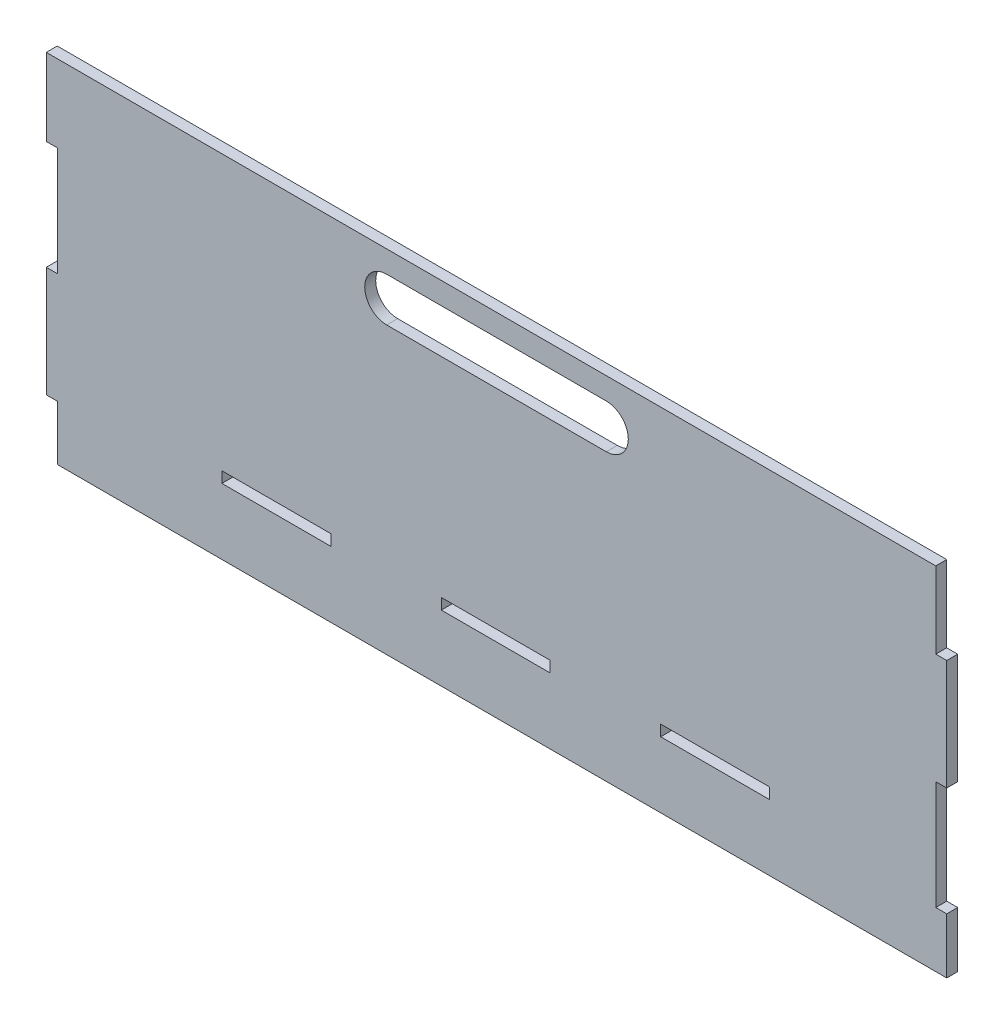
ISO-10303-21;
HEADER;
FILE_DESCRIPTION(('STEP AP214'),'2;1');
FILE_NAME('part.step','',(''),(''),'','','');
FILE_SCHEMA(('AUTOMOTIVE_DESIGN { 1 0 10303 214 1 1 1 1 }'));
ENDSEC;
DATA;
#1=APPLICATION_CONTEXT('core data for automotive mechanical design processes');
#2=APPLICATION_PROTOCOL_DEFINITION('international standard','automotive_design',2000,#1);
#3=PRODUCT_CONTEXT('',#1,'mechanical');
#4=PRODUCT('Part','Part','',(#3));
#5=PRODUCT_RELATED_PRODUCT_CATEGORY('part','',(#4));
#6=PRODUCT_DEFINITION_FORMATION('','',#4);
#7=PRODUCT_DEFINITION_CONTEXT('part definition',#1,'design');
#8=PRODUCT_DEFINITION('design','',#6,#7);
#9=PRODUCT_DEFINITION_SHAPE('','',#8);
#10=(LENGTH_UNIT() NAMED_UNIT(*) SI_UNIT(.MILLI.,.METRE.));
#11=(NAMED_UNIT(*) PLANE_ANGLE_UNIT() SI_UNIT($,.RADIAN.));
#12=(NAMED_UNIT(*) SI_UNIT($,.STERADIAN.) SOLID_ANGLE_UNIT());
#13=UNCERTAINTY_MEASURE_WITH_UNIT(LENGTH_MEASURE(1.E-05),#10,'distance_accuracy_value','');
#14=(GEOMETRIC_REPRESENTATION_CONTEXT(3) GLOBAL_UNCERTAINTY_ASSIGNED_CONTEXT((#13)) GLOBAL_UNIT_ASSIGNED_CONTEXT((#10,
#11,#12)) REPRESENTATION_CONTEXT('',''));
#15=CARTESIAN_POINT('',(0.,0.,0.));
#16=DIRECTION('',(0.,0.,1.));
#17=DIRECTION('',(1.,0.,0.));
#18=AXIS2_PLACEMENT_3D('',#15,#16,#17);
#19=CARTESIAN_POINT('',(410.,0.,5.));
#20=DIRECTION('',(-1.,0.,0.));
#21=DIRECTION('',(0.,0.,1.));
#22=AXIS2_PLACEMENT_3D('',#19,#20,#21);
#23=PLANE('',#22);
#24=DIRECTION('',(0.,1.,0.));
#25=VECTOR('',#24,1.);
#26=CARTESIAN_POINT('',(410.,0.,5.));
#27=LINE('',#26,#25);
#28=CARTESIAN_POINT('',(410.,74.9,5.));
#29=VERTEX_POINT('',#28);
#30=CARTESIAN_POINT('',(410.,125.2,5.));
#31=VERTEX_POINT('',#30);
#32=EDGE_CURVE('E440',#29,#31,#27,.T.);
#33=ORIENTED_EDGE('',*,*,#32,.F.);
#34=DIRECTION('',(0.,0.,-1.));
#35=VECTOR('',#34,1.);
#36=CARTESIAN_POINT('',(410.,74.9,5.));
#37=LINE('',#36,#35);
#38=CARTESIAN_POINT('',(410.,74.9,0.));
#39=VERTEX_POINT('',#38);
#40=EDGE_CURVE('E374',#29,#39,#37,.T.);
#41=ORIENTED_EDGE('',*,*,#40,.T.);
#42=DIRECTION('',(0.,1.,0.));
#43=VECTOR('',#42,1.);
#44=CARTESIAN_POINT('',(410.,0.,0.));
#45=LINE('',#44,#43);
#46=CARTESIAN_POINT('',(410.,125.2,0.));
#47=VERTEX_POINT('',#46);
#48=EDGE_CURVE('E449',#39,#47,#45,.T.);
#49=ORIENTED_EDGE('',*,*,#48,.T.);
#50=DIRECTION('',(0.,0.,1.));
#51=VECTOR('',#50,1.);
#52=CARTESIAN_POINT('',(410.,125.2,5.));
#53=LINE('',#52,#51);
#54=EDGE_CURVE('E390',#47,#31,#53,.T.);
#55=ORIENTED_EDGE('',*,*,#54,.T.);
#56=EDGE_LOOP('',(#33,#41,#49,#55));
#57=FACE_BOUND('',#56,.T.);
#58=ADVANCED_FACE('F34',(#57),#23,.F.);
#59=CARTESIAN_POINT('',(0.,0.,5.));
#60=DIRECTION('',(1.,0.,0.));
#61=DIRECTION('',(0.,0.,-1.));
#62=AXIS2_PLACEMENT_3D('',#59,#60,#61);
#63=PLANE('',#62);
#64=DIRECTION('',(0.,-1.,0.));
#65=VECTOR('',#64,1.);
#66=CARTESIAN_POINT('',(0.,0.,5.));
#67=LINE('',#66,#65);
#68=CARTESIAN_POINT('',(0.,160.,5.));
#69=VERTEX_POINT('',#68);
#70=CARTESIAN_POINT('',(0.,124.85,5.));
#71=VERTEX_POINT('',#70);
#72=EDGE_CURVE('E435',#69,#71,#67,.T.);
#73=ORIENTED_EDGE('',*,*,#72,.F.);
#74=DIRECTION('',(0.,0.,1.));
#75=VECTOR('',#74,1.);
#76=CARTESIAN_POINT('',(0.,160.,0.));
#77=LINE('',#76,#75);
#78=CARTESIAN_POINT('',(0.,160.,0.));
#79=VERTEX_POINT('',#78);
#80=EDGE_CURVE('E283',#79,#69,#77,.T.);
#81=ORIENTED_EDGE('',*,*,#80,.F.);
#82=DIRECTION('',(0.,-1.,0.));
#83=VECTOR('',#82,1.);
#84=CARTESIAN_POINT('',(0.,0.,0.));
#85=LINE('',#84,#83);
#86=CARTESIAN_POINT('',(0.,124.85,0.));
#87=VERTEX_POINT('',#86);
#88=EDGE_CURVE('E445',#79,#87,#85,.T.);
#89=ORIENTED_EDGE('',*,*,#88,.T.);
#90=DIRECTION('',(0.,0.,1.));
#91=VECTOR('',#90,1.);
#92=CARTESIAN_POINT('',(0.,124.85,5.));
#93=LINE('',#92,#91);
#94=EDGE_CURVE('E431',#87,#71,#93,.T.);
#95=ORIENTED_EDGE('',*,*,#94,.T.);
#96=EDGE_LOOP('',(#73,#81,#89,#95));
#97=FACE_BOUND('',#96,.T.);
#98=ADVANCED_FACE('F520',(#97),#63,.F.);
#99=CARTESIAN_POINT('',(0.,75.25,0.));
#100=VERTEX_POINT('',#99);
#101=CARTESIAN_POINT('',(0.,24.95,0.));
#102=VERTEX_POINT('',#101);
#103=EDGE_CURVE('E434',#100,#102,#85,.T.);
#104=ORIENTED_EDGE('',*,*,#103,.T.);
#105=DIRECTION('',(0.,0.,1.));
#106=VECTOR('',#105,1.);
#107=CARTESIAN_POINT('',(0.,24.95,5.));
#108=LINE('',#107,#106);
#109=CARTESIAN_POINT('',(0.,24.95,5.));
#110=VERTEX_POINT('',#109);
#111=EDGE_CURVE('E406',#102,#110,#108,.T.);
#112=ORIENTED_EDGE('',*,*,#111,.T.);
#113=CARTESIAN_POINT('',(0.,75.25,5.));
#114=VERTEX_POINT('',#113);
#115=EDGE_CURVE('E438',#114,#110,#67,.T.);
#116=ORIENTED_EDGE('',*,*,#115,.F.);
#117=DIRECTION('',(0.,0.,-1.));
#118=VECTOR('',#117,1.);
#119=CARTESIAN_POINT('',(0.,75.25,5.));
#120=LINE('',#119,#118);
#121=EDGE_CURVE('E426',#114,#100,#120,.T.);
#122=ORIENTED_EDGE('',*,*,#121,.T.);
#123=EDGE_LOOP('',(#104,#112,#116,#122));
#124=FACE_BOUND('',#123,.T.);
#125=ADVANCED_FACE('F525',(#124),#63,.F.);
#126=CARTESIAN_POINT('',(0.,0.,5.));
#127=DIRECTION('',(0.,1.,0.));
#128=DIRECTION('',(0.,0.,1.));
#129=AXIS2_PLACEMENT_3D('',#126,#127,#128);
#130=PLANE('',#129);
#131=DIRECTION('',(1.,0.,0.));
#132=VECTOR('',#131,1.);
#133=CARTESIAN_POINT('',(0.,0.,5.));
#134=LINE('',#133,#132);
#135=CARTESIAN_POINT('',(5.,0.,5.));
#136=VERTEX_POINT('',#135);
#137=CARTESIAN_POINT('',(410.,0.,5.));
#138=VERTEX_POINT('',#137);
#139=EDGE_CURVE('E437',#136,#138,#134,.T.);
#140=ORIENTED_EDGE('',*,*,#139,.F.);
#141=DIRECTION('',(0.,0.,-1.));
#142=VECTOR('',#141,1.);
#143=CARTESIAN_POINT('',(5.,0.,5.));
#144=LINE('',#143,#142);
#145=CARTESIAN_POINT('',(5.,0.,0.));
#146=VERTEX_POINT('',#145);
#147=EDGE_CURVE('E403',#136,#146,#144,.T.);
#148=ORIENTED_EDGE('',*,*,#147,.T.);
#149=DIRECTION('',(1.,0.,0.));
#150=VECTOR('',#149,1.);
#151=CARTESIAN_POINT('',(0.,0.,0.));
#152=LINE('',#151,#150);
#153=CARTESIAN_POINT('',(410.,0.,0.));
#154=VERTEX_POINT('',#153);
#155=EDGE_CURVE('E447',#146,#154,#152,.T.);
#156=ORIENTED_EDGE('',*,*,#155,.T.);
#157=DIRECTION('',(0.,0.,-1.));
#158=VECTOR('',#157,1.);
#159=CARTESIAN_POINT('',(410.,0.,5.));
#160=LINE('',#159,#158);
#161=EDGE_CURVE('E444',#138,#154,#160,.T.);
#162=ORIENTED_EDGE('',*,*,#161,.F.);
#163=EDGE_LOOP('',(#140,#148,#156,#162));
#164=FACE_BOUND('',#163,.T.);
#165=ADVANCED_FACE('F531',(#164),#130,.F.);
#166=CARTESIAN_POINT('',(410.,25.3,0.));
#167=VERTEX_POINT('',#166);
#168=EDGE_CURVE('E450',#154,#167,#45,.T.);
#169=ORIENTED_EDGE('',*,*,#168,.T.);
#170=DIRECTION('',(0.,0.,1.));
#171=VECTOR('',#170,1.);
#172=CARTESIAN_POINT('',(410.,25.3,5.));
#173=LINE('',#172,#171);
#174=CARTESIAN_POINT('',(410.,25.3,5.));
#175=VERTEX_POINT('',#174);
#176=EDGE_CURVE('E370',#167,#175,#173,.T.);
#177=ORIENTED_EDGE('',*,*,#176,.T.);
#178=EDGE_CURVE('E441',#138,#175,#27,.T.);
#179=ORIENTED_EDGE('',*,*,#178,.F.);
#180=ORIENTED_EDGE('',*,*,#161,.T.);
#181=EDGE_LOOP('',(#169,#177,#179,#180));
#182=FACE_BOUND('',#181,.T.);
#183=ADVANCED_FACE('F515',(#182),#23,.F.);
#184=CARTESIAN_POINT('',(0.,0.,5.));
#185=DIRECTION('',(0.,0.,-1.));
#186=DIRECTION('',(-1.,0.,0.));
#187=AXIS2_PLACEMENT_3D('',#184,#185,#186);
#188=PLANE('',#187);
#189=DIRECTION('',(1.,0.,0.));
#190=VECTOR('',#189,1.);
#191=CARTESIAN_POINT('',(155.,130.,5.));
#192=LINE('',#191,#190);
#193=CARTESIAN_POINT('',(155.,130.,5.));
#194=VERTEX_POINT('',#193);
#195=CARTESIAN_POINT('',(255.,130.,5.));
#196=VERTEX_POINT('',#195);
#197=EDGE_CURVE('E270',#194,#196,#192,.T.);
#198=ORIENTED_EDGE('',*,*,#197,.F.);
#199=CARTESIAN_POINT('',(155.,140.,5.));
#200=DIRECTION('',(0.,0.,1.));
#201=DIRECTION('',(1.,0.,0.));
#202=AXIS2_PLACEMENT_3D('',#199,#200,#201);
#203=CIRCLE('',#202,10.);
#204=CARTESIAN_POINT('',(155.,150.,5.));
#205=VERTEX_POINT('',#204);
#206=EDGE_CURVE('E49',#205,#194,#203,.T.);
#207=ORIENTED_EDGE('',*,*,#206,.F.);
#208=DIRECTION('',(-1.,0.,0.));
#209=VECTOR('',#208,1.);
#210=CARTESIAN_POINT('',(155.,150.,5.));
#211=LINE('',#210,#209);
#212=CARTESIAN_POINT('',(255.,150.,5.));
#213=VERTEX_POINT('',#212);
#214=EDGE_CURVE('E261',#213,#205,#211,.T.);
#215=ORIENTED_EDGE('',*,*,#214,.F.);
#216=CARTESIAN_POINT('',(255.,140.,5.));
#217=DIRECTION('',(0.,0.,1.));
#218=DIRECTION('',(1.,0.,0.));
#219=AXIS2_PLACEMENT_3D('',#216,#217,#218);
#220=CIRCLE('',#219,10.);
#221=EDGE_CURVE('E264',#196,#213,#220,.T.);
#222=ORIENTED_EDGE('',*,*,#221,.F.);
#223=EDGE_LOOP('',(#198,#207,#215,#222));
#224=FACE_BOUND('',#223,.T.);
#225=DIRECTION('',(1.,0.,0.));
#226=VECTOR('',#225,1.);
#227=CARTESIAN_POINT('',(179.85,30.,5.));
#228=LINE('',#227,#226);
#229=CARTESIAN_POINT('',(179.85,30.,5.));
#230=VERTEX_POINT('',#229);
#231=CARTESIAN_POINT('',(229.45,30.,5.));
#232=VERTEX_POINT('',#231);
#233=EDGE_CURVE('E288',#230,#232,#228,.T.);
#234=ORIENTED_EDGE('',*,*,#233,.F.);
#235=DIRECTION('',(0.,-1.,0.));
#236=VECTOR('',#235,1.);
#237=CARTESIAN_POINT('',(179.85,35.,5.));
#238=LINE('',#237,#236);
#239=CARTESIAN_POINT('',(179.85,35.,5.));
#240=VERTEX_POINT('',#239);
#241=EDGE_CURVE('E316',#240,#230,#238,.T.);
#242=ORIENTED_EDGE('',*,*,#241,.F.);
#243=DIRECTION('',(-1.,0.,0.));
#244=VECTOR('',#243,1.);
#245=CARTESIAN_POINT('',(179.85,35.,5.));
#246=LINE('',#245,#244);
#247=CARTESIAN_POINT('',(229.45,35.,5.));
#248=VERTEX_POINT('',#247);
#249=EDGE_CURVE('E308',#248,#240,#246,.T.);
#250=ORIENTED_EDGE('',*,*,#249,.F.);
#251=DIRECTION('',(0.,1.,0.));
#252=VECTOR('',#251,1.);
#253=CARTESIAN_POINT('',(229.45,35.,5.));
#254=LINE('',#253,#252);
#255=EDGE_CURVE('E300',#232,#248,#254,.T.);
#256=ORIENTED_EDGE('',*,*,#255,.F.);
#257=EDGE_LOOP('',(#234,#242,#250,#256));
#258=FACE_BOUND('',#257,.T.);
#259=DIRECTION('',(1.,0.,0.));
#260=VECTOR('',#259,1.);
#261=CARTESIAN_POINT('',(79.95,30.,5.));
#262=LINE('',#261,#260);
#263=CARTESIAN_POINT('',(79.95,30.,5.));
#264=VERTEX_POINT('',#263);
#265=CARTESIAN_POINT('',(129.55,30.,5.));
#266=VERTEX_POINT('',#265);
#267=EDGE_CURVE('E337',#264,#266,#262,.T.);
#268=ORIENTED_EDGE('',*,*,#267,.F.);
#269=DIRECTION('',(0.,-1.,0.));
#270=VECTOR('',#269,1.);
#271=CARTESIAN_POINT('',(79.95,35.,5.));
#272=LINE('',#271,#270);
#273=CARTESIAN_POINT('',(79.95,35.,5.));
#274=VERTEX_POINT('',#273);
#275=EDGE_CURVE('E321',#274,#264,#272,.T.);
#276=ORIENTED_EDGE('',*,*,#275,.F.);
#277=DIRECTION('',(-1.,0.,0.));
#278=VECTOR('',#277,1.);
#279=CARTESIAN_POINT('',(79.95,35.,5.));
#280=LINE('',#279,#278);
#281=CARTESIAN_POINT('',(129.55,35.,5.));
#282=VERTEX_POINT('',#281);
#283=EDGE_CURVE('E326',#282,#274,#280,.T.);
#284=ORIENTED_EDGE('',*,*,#283,.F.);
#285=DIRECTION('',(0.,1.,0.));
#286=VECTOR('',#285,1.);
#287=CARTESIAN_POINT('',(129.55,35.,5.));
#288=LINE('',#287,#286);
#289=EDGE_CURVE('E340',#266,#282,#288,.T.);
#290=ORIENTED_EDGE('',*,*,#289,.F.);
#291=EDGE_LOOP('',(#268,#276,#284,#290));
#292=FACE_BOUND('',#291,.T.);
#293=DIRECTION('',(0.,-1.,0.));
#294=VECTOR('',#293,1.);
#295=CARTESIAN_POINT('',(405.,174.8,5.));
#296=LINE('',#295,#294);
#297=CARTESIAN_POINT('',(405.,160.,5.));
#298=VERTEX_POINT('',#297);
#299=CARTESIAN_POINT('',(405.,125.2,5.));
#300=VERTEX_POINT('',#299);
#301=EDGE_CURVE('E377',#298,#300,#296,.T.);
#302=ORIENTED_EDGE('',*,*,#301,.F.);
#303=DIRECTION('',(1.,0.,0.));
#304=VECTOR('',#303,1.);
#305=CARTESIAN_POINT('',(0.,160.,5.));
#306=LINE('',#305,#304);
#307=EDGE_CURVE('E276',#69,#298,#306,.T.);
#308=ORIENTED_EDGE('',*,*,#307,.F.);
#309=ORIENTED_EDGE('',*,*,#72,.T.);
#310=DIRECTION('',(-1.,0.,0.));
#311=VECTOR('',#310,1.);
#312=CARTESIAN_POINT('',(-41.6760401275372,124.85,5.));
#313=LINE('',#312,#311);
#314=CARTESIAN_POINT('',(5.,124.85,5.));
#315=VERTEX_POINT('',#314);
#316=EDGE_CURVE('E414',#315,#71,#313,.T.);
#317=ORIENTED_EDGE('',*,*,#316,.F.);
#318=DIRECTION('',(0.,1.,0.));
#319=VECTOR('',#318,1.);
#320=CARTESIAN_POINT('',(5.,124.85,5.));
#321=LINE('',#320,#319);
#322=CARTESIAN_POINT('',(5.,75.25,5.));
#323=VERTEX_POINT('',#322);
#324=EDGE_CURVE('E419',#323,#315,#321,.T.);
#325=ORIENTED_EDGE('',*,*,#324,.F.);
#326=DIRECTION('',(1.,0.,0.));
#327=VECTOR('',#326,1.);
#328=CARTESIAN_POINT('',(-41.6760401275372,75.25,5.));
#329=LINE('',#328,#327);
#330=EDGE_CURVE('E409',#114,#323,#329,.T.);
#331=ORIENTED_EDGE('',*,*,#330,.F.);
#332=ORIENTED_EDGE('',*,*,#115,.T.);
#333=DIRECTION('',(-1.,0.,0.));
#334=VECTOR('',#333,1.);
#335=CARTESIAN_POINT('',(-41.6760401275372,24.95,5.));
#336=LINE('',#335,#334);
#337=CARTESIAN_POINT('',(5.,24.95,5.));
#338=VERTEX_POINT('',#337);
#339=EDGE_CURVE('E398',#338,#110,#336,.T.);
#340=ORIENTED_EDGE('',*,*,#339,.F.);
#341=DIRECTION('',(0.,1.,0.));
#342=VECTOR('',#341,1.);
#343=CARTESIAN_POINT('',(5.,24.95,5.));
#344=LINE('',#343,#342);
#345=EDGE_CURVE('E393',#136,#338,#344,.T.);
#346=ORIENTED_EDGE('',*,*,#345,.F.);
#347=ORIENTED_EDGE('',*,*,#139,.T.);
#348=ORIENTED_EDGE('',*,*,#178,.T.);
#349=DIRECTION('',(1.,0.,0.));
#350=VECTOR('',#349,1.);
#351=CARTESIAN_POINT('',(405.,25.3,5.));
#352=LINE('',#351,#350);
#353=CARTESIAN_POINT('',(405.,25.3,5.));
#354=VERTEX_POINT('',#353);
#355=EDGE_CURVE('E364',#354,#175,#352,.T.);
#356=ORIENTED_EDGE('',*,*,#355,.F.);
#357=DIRECTION('',(0.,-1.,0.));
#358=VECTOR('',#357,1.);
#359=CARTESIAN_POINT('',(405.,74.9,5.));
#360=LINE('',#359,#358);
#361=CARTESIAN_POINT('',(405.,74.9,5.));
#362=VERTEX_POINT('',#361);
#363=EDGE_CURVE('E347',#362,#354,#360,.T.);
#364=ORIENTED_EDGE('',*,*,#363,.F.);
#365=DIRECTION('',(-1.,0.,0.));
#366=VECTOR('',#365,1.);
#367=CARTESIAN_POINT('',(405.,74.9,5.));
#368=LINE('',#367,#366);
#369=EDGE_CURVE('E358',#29,#362,#368,.T.);
#370=ORIENTED_EDGE('',*,*,#369,.F.);
#371=ORIENTED_EDGE('',*,*,#32,.T.);
#372=DIRECTION('',(1.,0.,0.));
#373=VECTOR('',#372,1.);
#374=CARTESIAN_POINT('',(405.,125.2,5.));
#375=LINE('',#374,#373);
#376=EDGE_CURVE('E381',#300,#31,#375,.T.);
#377=ORIENTED_EDGE('',*,*,#376,.F.);
#378=EDGE_LOOP('',(#302,#308,#309,#317,#325,#331,#332,#340,#346,#347,#348,#356,#364,#370,#371,#377));
#379=FACE_BOUND('',#378,.T.);
#380=DIRECTION('',(0.,-1.,0.));
#381=VECTOR('',#380,1.);
#382=CARTESIAN_POINT('',(279.75,35.,5.));
#383=LINE('',#382,#381);
#384=CARTESIAN_POINT('',(279.75,35.,5.));
#385=VERTEX_POINT('',#384);
#386=CARTESIAN_POINT('',(279.75,30.,5.));
#387=VERTEX_POINT('',#386);
#388=EDGE_CURVE('E461',#385,#387,#383,.T.);
#389=ORIENTED_EDGE('',*,*,#388,.F.);
#390=DIRECTION('',(-1.,0.,0.));
#391=VECTOR('',#390,1.);
#392=CARTESIAN_POINT('',(279.75,35.,5.));
#393=LINE('',#392,#391);
#394=CARTESIAN_POINT('',(329.35,35.,5.));
#395=VERTEX_POINT('',#394);
#396=EDGE_CURVE('E463',#395,#385,#393,.T.);
#397=ORIENTED_EDGE('',*,*,#396,.F.);
#398=DIRECTION('',(0.,1.,0.));
#399=VECTOR('',#398,1.);
#400=CARTESIAN_POINT('',(329.35,35.,5.));
#401=LINE('',#400,#399);
#402=CARTESIAN_POINT('',(329.35,30.,5.));
#403=VERTEX_POINT('',#402);
#404=EDGE_CURVE('E466',#403,#395,#401,.T.);
#405=ORIENTED_EDGE('',*,*,#404,.F.);
#406=DIRECTION('',(1.,0.,0.));
#407=VECTOR('',#406,1.);
#408=CARTESIAN_POINT('',(279.75,30.,5.));
#409=LINE('',#408,#407);
#410=EDGE_CURVE('E469',#387,#403,#409,.T.);
#411=ORIENTED_EDGE('',*,*,#410,.F.);
#412=EDGE_LOOP('',(#389,#397,#405,#411));
#413=FACE_BOUND('',#412,.T.);
#414=ADVANCED_FACE('F498',(#224,#258,#292,#379,#413),#188,.F.);
#415=CARTESIAN_POINT('',(0.,0.,0.));
#416=DIRECTION('',(0.,0.,-1.));
#417=DIRECTION('',(-1.,0.,0.));
#418=AXIS2_PLACEMENT_3D('',#415,#416,#417);
#419=PLANE('',#418);
#420=CARTESIAN_POINT('',(155.,140.,0.));
#421=DIRECTION('',(0.,0.,1.));
#422=DIRECTION('',(1.,0.,0.));
#423=AXIS2_PLACEMENT_3D('',#420,#421,#422);
#424=CIRCLE('',#423,10.);
#425=CARTESIAN_POINT('',(155.,150.,0.));
#426=VERTEX_POINT('',#425);
#427=CARTESIAN_POINT('',(155.,130.,0.));
#428=VERTEX_POINT('',#427);
#429=EDGE_CURVE('E245',#426,#428,#424,.T.);
#430=ORIENTED_EDGE('',*,*,#429,.T.);
#431=DIRECTION('',(1.,0.,0.));
#432=VECTOR('',#431,1.);
#433=CARTESIAN_POINT('',(155.,130.,0.));
#434=LINE('',#433,#432);
#435=CARTESIAN_POINT('',(255.,130.,0.));
#436=VERTEX_POINT('',#435);
#437=EDGE_CURVE('E254',#428,#436,#434,.T.);
#438=ORIENTED_EDGE('',*,*,#437,.T.);
#439=CARTESIAN_POINT('',(255.,140.,0.));
#440=DIRECTION('',(0.,0.,1.));
#441=DIRECTION('',(1.,0.,0.));
#442=AXIS2_PLACEMENT_3D('',#439,#440,#441);
#443=CIRCLE('',#442,10.);
#444=CARTESIAN_POINT('',(255.,150.,0.));
#445=VERTEX_POINT('',#444);
#446=EDGE_CURVE('E57',#436,#445,#443,.T.);
#447=ORIENTED_EDGE('',*,*,#446,.T.);
#448=DIRECTION('',(-1.,0.,0.));
#449=VECTOR('',#448,1.);
#450=CARTESIAN_POINT('',(155.,150.,0.));
#451=LINE('',#450,#449);
#452=EDGE_CURVE('E251',#445,#426,#451,.T.);
#453=ORIENTED_EDGE('',*,*,#452,.T.);
#454=EDGE_LOOP('',(#430,#438,#447,#453));
#455=FACE_BOUND('',#454,.T.);
#456=DIRECTION('',(1.,0.,0.));
#457=VECTOR('',#456,1.);
#458=CARTESIAN_POINT('',(0.,160.,0.));
#459=LINE('',#458,#457);
#460=CARTESIAN_POINT('',(405.,160.,0.));
#461=VERTEX_POINT('',#460);
#462=EDGE_CURVE('E280',#79,#461,#459,.T.);
#463=ORIENTED_EDGE('',*,*,#462,.T.);
#464=DIRECTION('',(0.,-1.,0.));
#465=VECTOR('',#464,1.);
#466=CARTESIAN_POINT('',(405.,174.8,0.));
#467=LINE('',#466,#465);
#468=CARTESIAN_POINT('',(405.,125.2,0.));
#469=VERTEX_POINT('',#468);
#470=EDGE_CURVE('E378',#461,#469,#467,.T.);
#471=ORIENTED_EDGE('',*,*,#470,.T.);
#472=DIRECTION('',(1.,0.,0.));
#473=VECTOR('',#472,1.);
#474=CARTESIAN_POINT('',(405.,125.2,0.));
#475=LINE('',#474,#473);
#476=EDGE_CURVE('E380',#469,#47,#475,.T.);
#477=ORIENTED_EDGE('',*,*,#476,.T.);
#478=ORIENTED_EDGE('',*,*,#48,.F.);
#479=DIRECTION('',(1.,0.,0.));
#480=VECTOR('',#479,1.);
#481=CARTESIAN_POINT('',(0.,74.9,0.));
#482=LINE('',#481,#480);
#483=CARTESIAN_POINT('',(405.,74.9,0.));
#484=VERTEX_POINT('',#483);
#485=EDGE_CURVE('E459',#484,#39,#482,.T.);
#486=ORIENTED_EDGE('',*,*,#485,.F.);
#487=DIRECTION('',(0.,-1.,0.));
#488=VECTOR('',#487,1.);
#489=CARTESIAN_POINT('',(405.,74.9,0.));
#490=LINE('',#489,#488);
#491=CARTESIAN_POINT('',(405.,25.3,0.));
#492=VERTEX_POINT('',#491);
#493=EDGE_CURVE('E354',#484,#492,#490,.T.);
#494=ORIENTED_EDGE('',*,*,#493,.T.);
#495=DIRECTION('',(1.,0.,0.));
#496=VECTOR('',#495,1.);
#497=CARTESIAN_POINT('',(405.,25.3,0.));
#498=LINE('',#497,#496);
#499=EDGE_CURVE('E357',#492,#167,#498,.T.);
#500=ORIENTED_EDGE('',*,*,#499,.T.);
#501=ORIENTED_EDGE('',*,*,#168,.F.);
#502=ORIENTED_EDGE('',*,*,#155,.F.);
#503=DIRECTION('',(0.,-1.,0.));
#504=VECTOR('',#503,1.);
#505=CARTESIAN_POINT('',(5.,0.,0.));
#506=LINE('',#505,#504);
#507=CARTESIAN_POINT('',(5.,24.95,0.));
#508=VERTEX_POINT('',#507);
#509=EDGE_CURVE('E457',#508,#146,#506,.T.);
#510=ORIENTED_EDGE('',*,*,#509,.F.);
#511=DIRECTION('',(-1.,0.,0.));
#512=VECTOR('',#511,1.);
#513=CARTESIAN_POINT('',(-41.6760401275372,24.95,0.));
#514=LINE('',#513,#512);
#515=EDGE_CURVE('E394',#508,#102,#514,.T.);
#516=ORIENTED_EDGE('',*,*,#515,.T.);
#517=ORIENTED_EDGE('',*,*,#103,.F.);
#518=DIRECTION('',(-1.,0.,0.));
#519=VECTOR('',#518,1.);
#520=CARTESIAN_POINT('',(0.,75.25,0.));
#521=LINE('',#520,#519);
#522=CARTESIAN_POINT('',(5.,75.25,0.));
#523=VERTEX_POINT('',#522);
#524=EDGE_CURVE('E455',#523,#100,#521,.T.);
#525=ORIENTED_EDGE('',*,*,#524,.F.);
#526=DIRECTION('',(0.,1.,0.));
#527=VECTOR('',#526,1.);
#528=CARTESIAN_POINT('',(5.,124.85,0.));
#529=LINE('',#528,#527);
#530=CARTESIAN_POINT('',(5.,124.85,0.));
#531=VERTEX_POINT('',#530);
#532=EDGE_CURVE('E410',#523,#531,#529,.T.);
#533=ORIENTED_EDGE('',*,*,#532,.T.);
#534=DIRECTION('',(-1.,0.,0.));
#535=VECTOR('',#534,1.);
#536=CARTESIAN_POINT('',(-41.6760401275372,124.85,0.));
#537=LINE('',#536,#535);
#538=EDGE_CURVE('E413',#531,#87,#537,.T.);
#539=ORIENTED_EDGE('',*,*,#538,.T.);
#540=ORIENTED_EDGE('',*,*,#88,.F.);
#541=EDGE_LOOP('',(#463,#471,#477,#478,#486,#494,#500,#501,#502,#510,#516,#517,#525,#533,#539,#540));
#542=FACE_BOUND('',#541,.T.);
#543=DIRECTION('',(0.,-1.,0.));
#544=VECTOR('',#543,1.);
#545=CARTESIAN_POINT('',(179.85,35.,0.));
#546=LINE('',#545,#544);
#547=CARTESIAN_POINT('',(179.85,35.,0.));
#548=VERTEX_POINT('',#547);
#549=CARTESIAN_POINT('',(179.85,30.,0.));
#550=VERTEX_POINT('',#549);
#551=EDGE_CURVE('E318',#548,#550,#546,.T.);
#552=ORIENTED_EDGE('',*,*,#551,.T.);
#553=DIRECTION('',(1.,0.,0.));
#554=VECTOR('',#553,1.);
#555=CARTESIAN_POINT('',(179.85,30.,0.));
#556=LINE('',#555,#554);
#557=CARTESIAN_POINT('',(229.45,30.,0.));
#558=VERTEX_POINT('',#557);
#559=EDGE_CURVE('E291',#550,#558,#556,.T.);
#560=ORIENTED_EDGE('',*,*,#559,.T.);
#561=DIRECTION('',(0.,1.,0.));
#562=VECTOR('',#561,1.);
#563=CARTESIAN_POINT('',(229.45,35.,0.));
#564=LINE('',#563,#562);
#565=CARTESIAN_POINT('',(229.45,35.,0.));
#566=VERTEX_POINT('',#565);
#567=EDGE_CURVE('E305',#558,#566,#564,.T.);
#568=ORIENTED_EDGE('',*,*,#567,.T.);
#569=DIRECTION('',(-1.,0.,0.));
#570=VECTOR('',#569,1.);
#571=CARTESIAN_POINT('',(179.85,35.,0.));
#572=LINE('',#571,#570);
#573=EDGE_CURVE('E313',#566,#548,#572,.T.);
#574=ORIENTED_EDGE('',*,*,#573,.T.);
#575=EDGE_LOOP('',(#552,#560,#568,#574));
#576=FACE_BOUND('',#575,.T.);
#577=DIRECTION('',(0.,-1.,0.));
#578=VECTOR('',#577,1.);
#579=CARTESIAN_POINT('',(79.95,35.,0.));
#580=LINE('',#579,#578);
#581=CARTESIAN_POINT('',(79.95,35.,0.));
#582=VERTEX_POINT('',#581);
#583=CARTESIAN_POINT('',(79.95,30.,0.));
#584=VERTEX_POINT('',#583);
#585=EDGE_CURVE('E322',#582,#584,#580,.T.);
#586=ORIENTED_EDGE('',*,*,#585,.T.);
#587=DIRECTION('',(1.,0.,0.));
#588=VECTOR('',#587,1.);
#589=CARTESIAN_POINT('',(79.95,30.,0.));
#590=LINE('',#589,#588);
#591=CARTESIAN_POINT('',(129.55,30.,0.));
#592=VERTEX_POINT('',#591);
#593=EDGE_CURVE('E325',#584,#592,#590,.T.);
#594=ORIENTED_EDGE('',*,*,#593,.T.);
#595=DIRECTION('',(0.,1.,0.));
#596=VECTOR('',#595,1.);
#597=CARTESIAN_POINT('',(129.55,35.,0.));
#598=LINE('',#597,#596);
#599=CARTESIAN_POINT('',(129.55,35.,0.));
#600=VERTEX_POINT('',#599);
#601=EDGE_CURVE('E329',#592,#600,#598,.T.);
#602=ORIENTED_EDGE('',*,*,#601,.T.);
#603=DIRECTION('',(-1.,0.,0.));
#604=VECTOR('',#603,1.);
#605=CARTESIAN_POINT('',(79.95,35.,0.));
#606=LINE('',#605,#604);
#607=EDGE_CURVE('E332',#600,#582,#606,.T.);
#608=ORIENTED_EDGE('',*,*,#607,.T.);
#609=EDGE_LOOP('',(#586,#594,#602,#608));
#610=FACE_BOUND('',#609,.T.);
#611=DIRECTION('',(0.,-1.,0.));
#612=VECTOR('',#611,1.);
#613=CARTESIAN_POINT('',(279.75,35.,0.));
#614=LINE('',#613,#612);
#615=CARTESIAN_POINT('',(279.75,35.,0.));
#616=VERTEX_POINT('',#615);
#617=CARTESIAN_POINT('',(279.75,30.,0.));
#618=VERTEX_POINT('',#617);
#619=EDGE_CURVE('E472',#616,#618,#614,.T.);
#620=ORIENTED_EDGE('',*,*,#619,.T.);
#621=DIRECTION('',(1.,0.,0.));
#622=VECTOR('',#621,1.);
#623=CARTESIAN_POINT('',(279.75,30.,0.));
#624=LINE('',#623,#622);
#625=CARTESIAN_POINT('',(329.35,30.,0.));
#626=VERTEX_POINT('',#625);
#627=EDGE_CURVE('E474',#618,#626,#624,.T.);
#628=ORIENTED_EDGE('',*,*,#627,.T.);
#629=DIRECTION('',(0.,1.,0.));
#630=VECTOR('',#629,1.);
#631=CARTESIAN_POINT('',(329.35,35.,0.));
#632=LINE('',#631,#630);
#633=CARTESIAN_POINT('',(329.35,35.,0.));
#634=VERTEX_POINT('',#633);
#635=EDGE_CURVE('E476',#626,#634,#632,.T.);
#636=ORIENTED_EDGE('',*,*,#635,.T.);
#637=DIRECTION('',(-1.,0.,0.));
#638=VECTOR('',#637,1.);
#639=CARTESIAN_POINT('',(279.75,35.,0.));
#640=LINE('',#639,#638);
#641=EDGE_CURVE('E478',#634,#616,#640,.T.);
#642=ORIENTED_EDGE('',*,*,#641,.T.);
#643=EDGE_LOOP('',(#620,#628,#636,#642));
#644=FACE_BOUND('',#643,.T.);
#645=ADVANCED_FACE('F258',(#455,#542,#576,#610,#644),#419,.T.);
#646=CARTESIAN_POINT('',(-41.6760401275372,124.85,0.));
#647=DIRECTION('',(0.,1.,0.));
#648=DIRECTION('',(0.,0.,1.));
#649=AXIS2_PLACEMENT_3D('',#646,#647,#648);
#650=PLANE('',#649);
#651=ORIENTED_EDGE('',*,*,#538,.F.);
#652=DIRECTION('',(0.,0.,1.));
#653=VECTOR('',#652,1.);
#654=CARTESIAN_POINT('',(5.,124.85,0.));
#655=LINE('',#654,#653);
#656=EDGE_CURVE('E424',#531,#315,#655,.T.);
#657=ORIENTED_EDGE('',*,*,#656,.T.);
#658=ORIENTED_EDGE('',*,*,#316,.T.);
#659=ORIENTED_EDGE('',*,*,#94,.F.);
#660=EDGE_LOOP('',(#651,#657,#658,#659));
#661=FACE_BOUND('',#660,.T.);
#662=ADVANCED_FACE('F506',(#661),#650,.F.);
#663=CARTESIAN_POINT('',(-41.6760401275372,75.25,0.));
#664=DIRECTION('',(0.,-1.,0.));
#665=DIRECTION('',(0.,0.,-1.));
#666=AXIS2_PLACEMENT_3D('',#663,#664,#665);
#667=PLANE('',#666);
#668=ORIENTED_EDGE('',*,*,#330,.T.);
#669=DIRECTION('',(0.,0.,1.));
#670=VECTOR('',#669,1.);
#671=CARTESIAN_POINT('',(5.,75.25,0.));
#672=LINE('',#671,#670);
#673=EDGE_CURVE('E417',#523,#323,#672,.T.);
#674=ORIENTED_EDGE('',*,*,#673,.F.);
#675=ORIENTED_EDGE('',*,*,#524,.T.);
#676=ORIENTED_EDGE('',*,*,#121,.F.);
#677=EDGE_LOOP('',(#668,#674,#675,#676));
#678=FACE_BOUND('',#677,.T.);
#679=ADVANCED_FACE('F512',(#678),#667,.F.);
#680=CARTESIAN_POINT('',(5.,124.85,0.));
#681=DIRECTION('',(1.,0.,0.));
#682=DIRECTION('',(0.,1.,0.));
#683=AXIS2_PLACEMENT_3D('',#680,#681,#682);
#684=PLANE('',#683);
#685=ORIENTED_EDGE('',*,*,#324,.T.);
#686=ORIENTED_EDGE('',*,*,#656,.F.);
#687=ORIENTED_EDGE('',*,*,#532,.F.);
#688=ORIENTED_EDGE('',*,*,#673,.T.);
#689=EDGE_LOOP('',(#685,#686,#687,#688));
#690=FACE_BOUND('',#689,.T.);
#691=ADVANCED_FACE('F572',(#690),#684,.F.);
#692=CARTESIAN_POINT('',(-41.6760401275372,24.95,0.));
#693=DIRECTION('',(0.,1.,0.));
#694=DIRECTION('',(0.,0.,1.));
#695=AXIS2_PLACEMENT_3D('',#692,#693,#694);
#696=PLANE('',#695);
#697=ORIENTED_EDGE('',*,*,#515,.F.);
#698=DIRECTION('',(0.,0.,1.));
#699=VECTOR('',#698,1.);
#700=CARTESIAN_POINT('',(5.,24.95,0.));
#701=LINE('',#700,#699);
#702=EDGE_CURVE('E397',#508,#338,#701,.T.);
#703=ORIENTED_EDGE('',*,*,#702,.T.);
#704=ORIENTED_EDGE('',*,*,#339,.T.);
#705=ORIENTED_EDGE('',*,*,#111,.F.);
#706=EDGE_LOOP('',(#697,#703,#704,#705));
#707=FACE_BOUND('',#706,.T.);
#708=ADVANCED_FACE('F612',(#707),#696,.F.);
#709=CARTESIAN_POINT('',(5.,24.95,0.));
#710=DIRECTION('',(1.,0.,0.));
#711=DIRECTION('',(0.,1.,0.));
#712=AXIS2_PLACEMENT_3D('',#709,#710,#711);
#713=PLANE('',#712);
#714=ORIENTED_EDGE('',*,*,#345,.T.);
#715=ORIENTED_EDGE('',*,*,#702,.F.);
#716=ORIENTED_EDGE('',*,*,#509,.T.);
#717=ORIENTED_EDGE('',*,*,#147,.F.);
#718=EDGE_LOOP('',(#714,#715,#716,#717));
#719=FACE_BOUND('',#718,.T.);
#720=ADVANCED_FACE('F557',(#719),#713,.F.);
#721=CARTESIAN_POINT('',(405.,125.2,0.));
#722=DIRECTION('',(0.,-1.,0.));
#723=DIRECTION('',(0.,0.,-1.));
#724=AXIS2_PLACEMENT_3D('',#721,#722,#723);
#725=PLANE('',#724);
#726=ORIENTED_EDGE('',*,*,#476,.F.);
#727=DIRECTION('',(0.,0.,1.));
#728=VECTOR('',#727,1.);
#729=CARTESIAN_POINT('',(405.,125.2,0.));
#730=LINE('',#729,#728);
#731=EDGE_CURVE('E384',#469,#300,#730,.T.);
#732=ORIENTED_EDGE('',*,*,#731,.T.);
#733=ORIENTED_EDGE('',*,*,#376,.T.);
#734=ORIENTED_EDGE('',*,*,#54,.F.);
#735=EDGE_LOOP('',(#726,#732,#733,#734));
#736=FACE_BOUND('',#735,.T.);
#737=ADVANCED_FACE('F588',(#736),#725,.F.);
#738=CARTESIAN_POINT('',(405.,174.8,0.));
#739=DIRECTION('',(-1.,0.,0.));
#740=DIRECTION('',(0.,-1.,0.));
#741=AXIS2_PLACEMENT_3D('',#738,#739,#740);
#742=PLANE('',#741);
#743=ORIENTED_EDGE('',*,*,#470,.F.);
#744=DIRECTION('',(0.,0.,1.));
#745=VECTOR('',#744,1.);
#746=CARTESIAN_POINT('',(405.,160.,0.));
#747=LINE('',#746,#745);
#748=EDGE_CURVE('E285',#461,#298,#747,.T.);
#749=ORIENTED_EDGE('',*,*,#748,.T.);
#750=ORIENTED_EDGE('',*,*,#301,.T.);
#751=ORIENTED_EDGE('',*,*,#731,.F.);
#752=EDGE_LOOP('',(#743,#749,#750,#751));
#753=FACE_BOUND('',#752,.T.);
#754=ADVANCED_FACE('F585',(#753),#742,.F.);
#755=CARTESIAN_POINT('',(405.,74.9,0.));
#756=DIRECTION('',(0.,1.,0.));
#757=DIRECTION('',(0.,0.,1.));
#758=AXIS2_PLACEMENT_3D('',#755,#756,#757);
#759=PLANE('',#758);
#760=ORIENTED_EDGE('',*,*,#369,.T.);
#761=DIRECTION('',(0.,0.,1.));
#762=VECTOR('',#761,1.);
#763=CARTESIAN_POINT('',(405.,74.9,0.));
#764=LINE('',#763,#762);
#765=EDGE_CURVE('E367',#484,#362,#764,.T.);
#766=ORIENTED_EDGE('',*,*,#765,.F.);
#767=ORIENTED_EDGE('',*,*,#485,.T.);
#768=ORIENTED_EDGE('',*,*,#40,.F.);
#769=EDGE_LOOP('',(#760,#766,#767,#768));
#770=FACE_BOUND('',#769,.T.);
#771=ADVANCED_FACE('F592',(#770),#759,.F.);
#772=CARTESIAN_POINT('',(405.,25.3,0.));
#773=DIRECTION('',(0.,-1.,0.));
#774=DIRECTION('',(0.,0.,-1.));
#775=AXIS2_PLACEMENT_3D('',#772,#773,#774);
#776=PLANE('',#775);
#777=ORIENTED_EDGE('',*,*,#499,.F.);
#778=DIRECTION('',(0.,0.,1.));
#779=VECTOR('',#778,1.);
#780=CARTESIAN_POINT('',(405.,25.3,0.));
#781=LINE('',#780,#779);
#782=EDGE_CURVE('E361',#492,#354,#781,.T.);
#783=ORIENTED_EDGE('',*,*,#782,.T.);
#784=ORIENTED_EDGE('',*,*,#355,.T.);
#785=ORIENTED_EDGE('',*,*,#176,.F.);
#786=EDGE_LOOP('',(#777,#783,#784,#785));
#787=FACE_BOUND('',#786,.T.);
#788=ADVANCED_FACE('F547',(#787),#776,.F.);
#789=CARTESIAN_POINT('',(405.,74.9,0.));
#790=DIRECTION('',(-1.,0.,0.));
#791=DIRECTION('',(0.,-1.,0.));
#792=AXIS2_PLACEMENT_3D('',#789,#790,#791);
#793=PLANE('',#792);
#794=ORIENTED_EDGE('',*,*,#363,.T.);
#795=ORIENTED_EDGE('',*,*,#782,.F.);
#796=ORIENTED_EDGE('',*,*,#493,.F.);
#797=ORIENTED_EDGE('',*,*,#765,.T.);
#798=EDGE_LOOP('',(#794,#795,#796,#797));
#799=FACE_BOUND('',#798,.T.);
#800=ADVANCED_FACE('F594',(#799),#793,.F.);
#801=CARTESIAN_POINT('',(79.95,35.,0.));
#802=DIRECTION('',(-1.,0.,0.));
#803=DIRECTION('',(0.,0.,1.));
#804=AXIS2_PLACEMENT_3D('',#801,#802,#803);
#805=PLANE('',#804);
#806=ORIENTED_EDGE('',*,*,#275,.T.);
#807=DIRECTION('',(0.,0.,1.));
#808=VECTOR('',#807,1.);
#809=CARTESIAN_POINT('',(79.95,30.,0.));
#810=LINE('',#809,#808);
#811=EDGE_CURVE('E335',#584,#264,#810,.T.);
#812=ORIENTED_EDGE('',*,*,#811,.F.);
#813=ORIENTED_EDGE('',*,*,#585,.F.);
#814=DIRECTION('',(0.,0.,1.));
#815=VECTOR('',#814,1.);
#816=CARTESIAN_POINT('',(79.95,35.,0.));
#817=LINE('',#816,#815);
#818=EDGE_CURVE('E345',#582,#274,#817,.T.);
#819=ORIENTED_EDGE('',*,*,#818,.T.);
#820=EDGE_LOOP('',(#806,#812,#813,#819));
#821=FACE_BOUND('',#820,.T.);
#822=ADVANCED_FACE('F596',(#821),#805,.F.);
#823=CARTESIAN_POINT('',(79.95,35.,0.));
#824=DIRECTION('',(0.,1.,0.));
#825=DIRECTION('',(-1.,0.,0.));
#826=AXIS2_PLACEMENT_3D('',#823,#824,#825);
#827=PLANE('',#826);
#828=ORIENTED_EDGE('',*,*,#283,.T.);
#829=ORIENTED_EDGE('',*,*,#818,.F.);
#830=ORIENTED_EDGE('',*,*,#607,.F.);
#831=DIRECTION('',(0.,0.,1.));
#832=VECTOR('',#831,1.);
#833=CARTESIAN_POINT('',(129.55,35.,0.));
#834=LINE('',#833,#832);
#835=EDGE_CURVE('E348',#600,#282,#834,.T.);
#836=ORIENTED_EDGE('',*,*,#835,.T.);
#837=EDGE_LOOP('',(#828,#829,#830,#836));
#838=FACE_BOUND('',#837,.T.);
#839=ADVANCED_FACE('F602',(#838),#827,.F.);
#840=CARTESIAN_POINT('',(129.55,35.,0.));
#841=DIRECTION('',(1.,0.,0.));
#842=DIRECTION('',(0.,0.,-1.));
#843=AXIS2_PLACEMENT_3D('',#840,#841,#842);
#844=PLANE('',#843);
#845=ORIENTED_EDGE('',*,*,#289,.T.);
#846=ORIENTED_EDGE('',*,*,#835,.F.);
#847=ORIENTED_EDGE('',*,*,#601,.F.);
#848=DIRECTION('',(0.,0.,1.));
#849=VECTOR('',#848,1.);
#850=CARTESIAN_POINT('',(129.55,30.,0.));
#851=LINE('',#850,#849);
#852=EDGE_CURVE('E350',#592,#266,#851,.T.);
#853=ORIENTED_EDGE('',*,*,#852,.T.);
#854=EDGE_LOOP('',(#845,#846,#847,#853));
#855=FACE_BOUND('',#854,.T.);
#856=ADVANCED_FACE('F673',(#855),#844,.F.);
#857=CARTESIAN_POINT('',(79.95,30.,0.));
#858=DIRECTION('',(0.,-1.,0.));
#859=DIRECTION('',(0.,0.,-1.));
#860=AXIS2_PLACEMENT_3D('',#857,#858,#859);
#861=PLANE('',#860);
#862=ORIENTED_EDGE('',*,*,#267,.T.);
#863=ORIENTED_EDGE('',*,*,#852,.F.);
#864=ORIENTED_EDGE('',*,*,#593,.F.);
#865=ORIENTED_EDGE('',*,*,#811,.T.);
#866=EDGE_LOOP('',(#862,#863,#864,#865));
#867=FACE_BOUND('',#866,.T.);
#868=ADVANCED_FACE('F683',(#867),#861,.F.);
#869=CARTESIAN_POINT('',(179.85,35.,0.));
#870=DIRECTION('',(-1.,0.,0.));
#871=DIRECTION('',(0.,0.,1.));
#872=AXIS2_PLACEMENT_3D('',#869,#870,#871);
#873=PLANE('',#872);
#874=ORIENTED_EDGE('',*,*,#241,.T.);
#875=DIRECTION('',(0.,0.,1.));
#876=VECTOR('',#875,1.);
#877=CARTESIAN_POINT('',(179.85,30.,0.));
#878=LINE('',#877,#876);
#879=EDGE_CURVE('E297',#550,#230,#878,.T.);
#880=ORIENTED_EDGE('',*,*,#879,.F.);
#881=ORIENTED_EDGE('',*,*,#551,.F.);
#882=DIRECTION('',(0.,0.,1.));
#883=VECTOR('',#882,1.);
#884=CARTESIAN_POINT('',(179.85,35.,0.));
#885=LINE('',#884,#883);
#886=EDGE_CURVE('E310',#548,#240,#885,.T.);
#887=ORIENTED_EDGE('',*,*,#886,.T.);
#888=EDGE_LOOP('',(#874,#880,#881,#887));
#889=FACE_BOUND('',#888,.T.);
#890=ADVANCED_FACE('F693',(#889),#873,.F.);
#891=CARTESIAN_POINT('',(179.85,35.,0.));
#892=DIRECTION('',(0.,1.,0.));
#893=DIRECTION('',(-1.,0.,0.));
#894=AXIS2_PLACEMENT_3D('',#891,#892,#893);
#895=PLANE('',#894);
#896=ORIENTED_EDGE('',*,*,#249,.T.);
#897=ORIENTED_EDGE('',*,*,#886,.F.);
#898=ORIENTED_EDGE('',*,*,#573,.F.);
#899=DIRECTION('',(0.,0.,1.));
#900=VECTOR('',#899,1.);
#901=CARTESIAN_POINT('',(229.45,35.,0.));
#902=LINE('',#901,#900);
#903=EDGE_CURVE('E302',#566,#248,#902,.T.);
#904=ORIENTED_EDGE('',*,*,#903,.T.);
#905=EDGE_LOOP('',(#896,#897,#898,#904));
#906=FACE_BOUND('',#905,.T.);
#907=ADVANCED_FACE('F703',(#906),#895,.F.);
#908=CARTESIAN_POINT('',(229.45,35.,0.));
#909=DIRECTION('',(1.,0.,0.));
#910=DIRECTION('',(0.,0.,-1.));
#911=AXIS2_PLACEMENT_3D('',#908,#909,#910);
#912=PLANE('',#911);
#913=ORIENTED_EDGE('',*,*,#255,.T.);
#914=ORIENTED_EDGE('',*,*,#903,.F.);
#915=ORIENTED_EDGE('',*,*,#567,.F.);
#916=DIRECTION('',(0.,0.,1.));
#917=VECTOR('',#916,1.);
#918=CARTESIAN_POINT('',(229.45,30.,0.));
#919=LINE('',#918,#917);
#920=EDGE_CURVE('E294',#558,#232,#919,.T.);
#921=ORIENTED_EDGE('',*,*,#920,.T.);
#922=EDGE_LOOP('',(#913,#914,#915,#921));
#923=FACE_BOUND('',#922,.T.);
#924=ADVANCED_FACE('F713',(#923),#912,.F.);
#925=CARTESIAN_POINT('',(179.85,30.,0.));
#926=DIRECTION('',(0.,-1.,0.));
#927=DIRECTION('',(0.,0.,-1.));
#928=AXIS2_PLACEMENT_3D('',#925,#926,#927);
#929=PLANE('',#928);
#930=ORIENTED_EDGE('',*,*,#233,.T.);
#931=ORIENTED_EDGE('',*,*,#920,.F.);
#932=ORIENTED_EDGE('',*,*,#559,.F.);
#933=ORIENTED_EDGE('',*,*,#879,.T.);
#934=EDGE_LOOP('',(#930,#931,#932,#933));
#935=FACE_BOUND('',#934,.T.);
#936=ADVANCED_FACE('F723',(#935),#929,.F.);
#937=CARTESIAN_POINT('',(279.75,30.,0.));
#938=DIRECTION('',(0.,-1.,0.));
#939=DIRECTION('',(0.,0.,-1.));
#940=AXIS2_PLACEMENT_3D('',#937,#938,#939);
#941=PLANE('',#940);
#942=ORIENTED_EDGE('',*,*,#410,.T.);
#943=DIRECTION('',(0.,0.,1.));
#944=VECTOR('',#943,1.);
#945=CARTESIAN_POINT('',(329.35,30.,0.));
#946=LINE('',#945,#944);
#947=EDGE_CURVE('E11',#626,#403,#946,.T.);
#948=ORIENTED_EDGE('',*,*,#947,.F.);
#949=ORIENTED_EDGE('',*,*,#627,.F.);
#950=DIRECTION('',(0.,0.,1.));
#951=VECTOR('',#950,1.);
#952=CARTESIAN_POINT('',(279.75,30.,0.));
#953=LINE('',#952,#951);
#954=EDGE_CURVE('E481',#618,#387,#953,.T.);
#955=ORIENTED_EDGE('',*,*,#954,.T.);
#956=EDGE_LOOP('',(#942,#948,#949,#955));
#957=FACE_BOUND('',#956,.T.);
#958=ADVANCED_FACE('F36',(#957),#941,.F.);
#959=CARTESIAN_POINT('',(329.35,35.,0.));
#960=DIRECTION('',(1.,0.,0.));
#961=DIRECTION('',(0.,0.,-1.));
#962=AXIS2_PLACEMENT_3D('',#959,#960,#961);
#963=PLANE('',#962);
#964=ORIENTED_EDGE('',*,*,#404,.T.);
#965=DIRECTION('',(0.,0.,1.));
#966=VECTOR('',#965,1.);
#967=CARTESIAN_POINT('',(329.35,35.,0.));
#968=LINE('',#967,#966);
#969=EDGE_CURVE('E42',#634,#395,#968,.T.);
#970=ORIENTED_EDGE('',*,*,#969,.F.);
#971=ORIENTED_EDGE('',*,*,#635,.F.);
#972=ORIENTED_EDGE('',*,*,#947,.T.);
#973=EDGE_LOOP('',(#964,#970,#971,#972));
#974=FACE_BOUND('',#973,.T.);
#975=ADVANCED_FACE('F494',(#974),#963,.F.);
#976=CARTESIAN_POINT('',(279.75,35.,0.));
#977=DIRECTION('',(0.,1.,0.));
#978=DIRECTION('',(-1.,0.,0.));
#979=AXIS2_PLACEMENT_3D('',#976,#977,#978);
#980=PLANE('',#979);
#981=ORIENTED_EDGE('',*,*,#396,.T.);
#982=DIRECTION('',(0.,0.,1.));
#983=VECTOR('',#982,1.);
#984=CARTESIAN_POINT('',(279.75,35.,0.));
#985=LINE('',#984,#983);
#986=EDGE_CURVE('E484',#616,#385,#985,.T.);
#987=ORIENTED_EDGE('',*,*,#986,.F.);
#988=ORIENTED_EDGE('',*,*,#641,.F.);
#989=ORIENTED_EDGE('',*,*,#969,.T.);
#990=EDGE_LOOP('',(#981,#987,#988,#989));
#991=FACE_BOUND('',#990,.T.);
#992=ADVANCED_FACE('F490',(#991),#980,.F.);
#993=CARTESIAN_POINT('',(279.75,35.,0.));
#994=DIRECTION('',(-1.,0.,0.));
#995=DIRECTION('',(0.,0.,1.));
#996=AXIS2_PLACEMENT_3D('',#993,#994,#995);
#997=PLANE('',#996);
#998=ORIENTED_EDGE('',*,*,#388,.T.);
#999=ORIENTED_EDGE('',*,*,#954,.F.);
#1000=ORIENTED_EDGE('',*,*,#619,.F.);
#1001=ORIENTED_EDGE('',*,*,#986,.T.);
#1002=EDGE_LOOP('',(#998,#999,#1000,#1001));
#1003=FACE_BOUND('',#1002,.T.);
#1004=ADVANCED_FACE('F503',(#1003),#997,.F.);
#1005=CARTESIAN_POINT('',(0.,160.,0.));
#1006=DIRECTION('',(0.,-1.,0.));
#1007=DIRECTION('',(0.,0.,-1.));
#1008=AXIS2_PLACEMENT_3D('',#1005,#1006,#1007);
#1009=PLANE('',#1008);
#1010=ORIENTED_EDGE('',*,*,#307,.T.);
#1011=ORIENTED_EDGE('',*,*,#748,.F.);
#1012=ORIENTED_EDGE('',*,*,#462,.F.);
#1013=ORIENTED_EDGE('',*,*,#80,.T.);
#1014=EDGE_LOOP('',(#1010,#1011,#1012,#1013));
#1015=FACE_BOUND('',#1014,.T.);
#1016=ADVANCED_FACE('F580',(#1015),#1009,.F.);
#1017=CARTESIAN_POINT('',(155.,140.,0.));
#1018=DIRECTION('',(0.,0.,1.));
#1019=DIRECTION('',(1.,0.,0.));
#1020=AXIS2_PLACEMENT_3D('',#1017,#1018,#1019);
#1021=CYLINDRICAL_SURFACE('',#1020,10.);
#1022=ORIENTED_EDGE('',*,*,#206,.T.);
#1023=DIRECTION('',(0.,0.,1.));
#1024=VECTOR('',#1023,1.);
#1025=CARTESIAN_POINT('',(155.,130.,0.));
#1026=LINE('',#1025,#1024);
#1027=EDGE_CURVE('E241',#428,#194,#1026,.T.);
#1028=ORIENTED_EDGE('',*,*,#1027,.F.);
#1029=ORIENTED_EDGE('',*,*,#429,.F.);
#1030=DIRECTION('',(0.,0.,1.));
#1031=VECTOR('',#1030,1.);
#1032=CARTESIAN_POINT('',(155.,150.,0.));
#1033=LINE('',#1032,#1031);
#1034=EDGE_CURVE('E274',#426,#205,#1033,.T.);
#1035=ORIENTED_EDGE('',*,*,#1034,.T.);
#1036=EDGE_LOOP('',(#1022,#1028,#1029,#1035));
#1037=FACE_BOUND('',#1036,.T.);
#1038=ADVANCED_FACE('F243',(#1037),#1021,.F.);
#1039=CARTESIAN_POINT('',(155.,150.,0.));
#1040=DIRECTION('',(0.,1.,0.));
#1041=DIRECTION('',(0.,0.,1.));
#1042=AXIS2_PLACEMENT_3D('',#1039,#1040,#1041);
#1043=PLANE('',#1042);
#1044=ORIENTED_EDGE('',*,*,#214,.T.);
#1045=ORIENTED_EDGE('',*,*,#1034,.F.);
#1046=ORIENTED_EDGE('',*,*,#452,.F.);
#1047=DIRECTION('',(0.,0.,1.));
#1048=VECTOR('',#1047,1.);
#1049=CARTESIAN_POINT('',(255.,150.,0.));
#1050=LINE('',#1049,#1048);
#1051=EDGE_CURVE('E277',#445,#213,#1050,.T.);
#1052=ORIENTED_EDGE('',*,*,#1051,.T.);
#1053=EDGE_LOOP('',(#1044,#1045,#1046,#1052));
#1054=FACE_BOUND('',#1053,.T.);
#1055=ADVANCED_FACE('F831',(#1054),#1043,.F.);
#1056=CARTESIAN_POINT('',(255.,140.,0.));
#1057=DIRECTION('',(0.,0.,1.));
#1058=DIRECTION('',(1.,0.,0.));
#1059=AXIS2_PLACEMENT_3D('',#1056,#1057,#1058);
#1060=CYLINDRICAL_SURFACE('',#1059,10.);
#1061=ORIENTED_EDGE('',*,*,#221,.T.);
#1062=ORIENTED_EDGE('',*,*,#1051,.F.);
#1063=ORIENTED_EDGE('',*,*,#446,.F.);
#1064=DIRECTION('',(0.,0.,1.));
#1065=VECTOR('',#1064,1.);
#1066=CARTESIAN_POINT('',(255.,130.,0.));
#1067=LINE('',#1066,#1065);
#1068=EDGE_CURVE('E250',#436,#196,#1067,.T.);
#1069=ORIENTED_EDGE('',*,*,#1068,.T.);
#1070=EDGE_LOOP('',(#1061,#1062,#1063,#1069));
#1071=FACE_BOUND('',#1070,.T.);
#1072=ADVANCED_FACE('F838',(#1071),#1060,.F.);
#1073=CARTESIAN_POINT('',(155.,130.,0.));
#1074=DIRECTION('',(0.,-1.,0.));
#1075=DIRECTION('',(0.,0.,-1.));
#1076=AXIS2_PLACEMENT_3D('',#1073,#1074,#1075);
#1077=PLANE('',#1076);
#1078=ORIENTED_EDGE('',*,*,#197,.T.);
#1079=ORIENTED_EDGE('',*,*,#1068,.F.);
#1080=ORIENTED_EDGE('',*,*,#437,.F.);
#1081=ORIENTED_EDGE('',*,*,#1027,.T.);
#1082=EDGE_LOOP('',(#1078,#1079,#1080,#1081));
#1083=FACE_BOUND('',#1082,.T.);
#1084=ADVANCED_FACE('F255',(#1083),#1077,.F.);
#1085=CLOSED_SHELL('',(#58,#98,#125,#165,#183,#414,#645,#662,#679,#691,#708,#720,#737,#754,#771,
#788,#800,#822,#839,#856,#868,#890,#907,#924,#936,#958,#975,#992,#1004,#1016,#1038,#1055,#1072,#1084));
#1086=MANIFOLD_SOLID_BREP('B2',#1085);
#1087=ADVANCED_BREP_SHAPE_REPRESENTATION('',(#18,#1086),#14);
#1088=SHAPE_DEFINITION_REPRESENTATION(#9,#1087);
ENDSEC;
END-ISO-10303-21;
